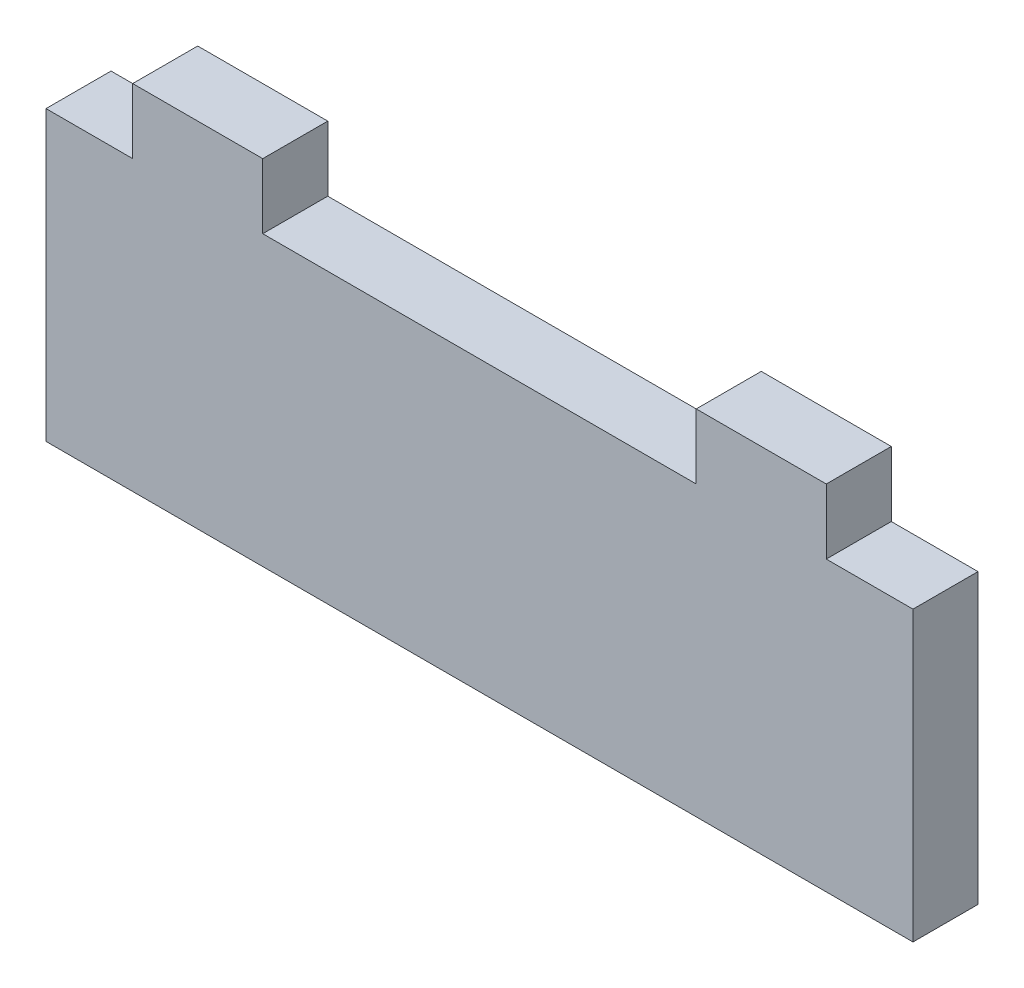
ISO-10303-21;
HEADER;
FILE_DESCRIPTION(('STEP AP214'),'2;1');
FILE_NAME('part.step','',(''),(''),'','','');
FILE_SCHEMA(('AUTOMOTIVE_DESIGN { 1 0 10303 214 1 1 1 1 }'));
ENDSEC;
DATA;
#1=APPLICATION_CONTEXT('core data for automotive mechanical design processes');
#2=APPLICATION_PROTOCOL_DEFINITION('international standard','automotive_design',2000,#1);
#3=PRODUCT_CONTEXT('',#1,'mechanical');
#4=PRODUCT('Part','Part','',(#3));
#5=PRODUCT_RELATED_PRODUCT_CATEGORY('part','',(#4));
#6=PRODUCT_DEFINITION_FORMATION('','',#4);
#7=PRODUCT_DEFINITION_CONTEXT('part definition',#1,'design');
#8=PRODUCT_DEFINITION('design','',#6,#7);
#9=PRODUCT_DEFINITION_SHAPE('','',#8);
#10=(LENGTH_UNIT() NAMED_UNIT(*) SI_UNIT(.MILLI.,.METRE.));
#11=(NAMED_UNIT(*) PLANE_ANGLE_UNIT() SI_UNIT($,.RADIAN.));
#12=(NAMED_UNIT(*) SI_UNIT($,.STERADIAN.) SOLID_ANGLE_UNIT());
#13=UNCERTAINTY_MEASURE_WITH_UNIT(LENGTH_MEASURE(1.E-05),#10,'distance_accuracy_value','');
#14=(GEOMETRIC_REPRESENTATION_CONTEXT(3) GLOBAL_UNCERTAINTY_ASSIGNED_CONTEXT((#13)) GLOBAL_UNIT_ASSIGNED_CONTEXT((#10,
#11,#12)) REPRESENTATION_CONTEXT('',''));
#15=CARTESIAN_POINT('',(0.,0.,0.));
#16=DIRECTION('',(0.,0.,1.));
#17=DIRECTION('',(1.,0.,0.));
#18=AXIS2_PLACEMENT_3D('',#15,#16,#17);
#19=CARTESIAN_POINT('',(-20.,0.,3.));
#20=DIRECTION('',(-1.,0.,0.));
#21=DIRECTION('',(0.,-1.,0.));
#22=AXIS2_PLACEMENT_3D('',#19,#20,#21);
#23=PLANE('',#22);
#24=DIRECTION('',(0.,1.,0.));
#25=VECTOR('',#24,1.);
#26=CARTESIAN_POINT('',(-20.,0.,0.));
#27=LINE('',#26,#25);
#28=CARTESIAN_POINT('',(-20.,-6.65,0.));
#29=VERTEX_POINT('',#28);
#30=CARTESIAN_POINT('',(-20.,6.65,0.));
#31=VERTEX_POINT('',#30);
#32=EDGE_CURVE('E158',#29,#31,#27,.T.);
#33=ORIENTED_EDGE('',*,*,#32,.F.);
#34=DIRECTION('',(0.,0.,-1.));
#35=VECTOR('',#34,1.);
#36=CARTESIAN_POINT('',(-20.,-6.65,3.));
#37=LINE('',#36,#35);
#38=CARTESIAN_POINT('',(-20.,-6.65,3.));
#39=VERTEX_POINT('',#38);
#40=EDGE_CURVE('E11',#39,#29,#37,.T.);
#41=ORIENTED_EDGE('',*,*,#40,.F.);
#42=DIRECTION('',(0.,1.,0.));
#43=VECTOR('',#42,1.);
#44=CARTESIAN_POINT('',(-20.,0.,3.));
#45=LINE('',#44,#43);
#46=CARTESIAN_POINT('',(-20.,6.65,3.));
#47=VERTEX_POINT('',#46);
#48=EDGE_CURVE('E219',#39,#47,#45,.T.);
#49=ORIENTED_EDGE('',*,*,#48,.T.);
#50=DIRECTION('',(0.,0.,-1.));
#51=VECTOR('',#50,1.);
#52=CARTESIAN_POINT('',(-20.,6.65,3.));
#53=LINE('',#52,#51);
#54=EDGE_CURVE('E103',#47,#31,#53,.T.);
#55=ORIENTED_EDGE('',*,*,#54,.T.);
#56=EDGE_LOOP('',(#33,#41,#49,#55));
#57=FACE_BOUND('',#56,.T.);
#58=ADVANCED_FACE('F41',(#57),#23,.T.);
#59=CARTESIAN_POINT('',(0.,-6.65,3.));
#60=DIRECTION('',(0.,-1.,0.));
#61=DIRECTION('',(1.,0.,0.));
#62=AXIS2_PLACEMENT_3D('',#59,#60,#61);
#63=PLANE('',#62);
#64=DIRECTION('',(-1.,0.,0.));
#65=VECTOR('',#64,1.);
#66=CARTESIAN_POINT('',(0.,-6.65,0.));
#67=LINE('',#66,#65);
#68=CARTESIAN_POINT('',(20.,-6.65,0.));
#69=VERTEX_POINT('',#68);
#70=EDGE_CURVE('E161',#69,#29,#67,.T.);
#71=ORIENTED_EDGE('',*,*,#70,.F.);
#72=DIRECTION('',(0.,0.,-1.));
#73=VECTOR('',#72,1.);
#74=CARTESIAN_POINT('',(20.,-6.65,3.));
#75=LINE('',#74,#73);
#76=CARTESIAN_POINT('',(20.,-6.65,3.));
#77=VERTEX_POINT('',#76);
#78=EDGE_CURVE('E49',#77,#69,#75,.T.);
#79=ORIENTED_EDGE('',*,*,#78,.F.);
#80=DIRECTION('',(-1.,0.,0.));
#81=VECTOR('',#80,1.);
#82=CARTESIAN_POINT('',(0.,-6.65,3.));
#83=LINE('',#82,#81);
#84=EDGE_CURVE('E218',#77,#39,#83,.T.);
#85=ORIENTED_EDGE('',*,*,#84,.T.);
#86=ORIENTED_EDGE('',*,*,#40,.T.);
#87=EDGE_LOOP('',(#71,#79,#85,#86));
#88=FACE_BOUND('',#87,.T.);
#89=ADVANCED_FACE('F217',(#88),#63,.T.);
#90=CARTESIAN_POINT('',(20.,0.,3.));
#91=DIRECTION('',(-1.,0.,0.));
#92=DIRECTION('',(0.,-1.,0.));
#93=AXIS2_PLACEMENT_3D('',#90,#91,#92);
#94=PLANE('',#93);
#95=DIRECTION('',(0.,1.,0.));
#96=VECTOR('',#95,1.);
#97=CARTESIAN_POINT('',(20.,0.,0.));
#98=LINE('',#97,#96);
#99=CARTESIAN_POINT('',(20.,6.65,0.));
#100=VERTEX_POINT('',#99);
#101=EDGE_CURVE('E164',#69,#100,#98,.T.);
#102=ORIENTED_EDGE('',*,*,#101,.T.);
#103=DIRECTION('',(0.,0.,-1.));
#104=VECTOR('',#103,1.);
#105=CARTESIAN_POINT('',(20.,6.65,3.));
#106=LINE('',#105,#104);
#107=CARTESIAN_POINT('',(20.,6.65,3.));
#108=VERTEX_POINT('',#107);
#109=EDGE_CURVE('E201',#108,#100,#106,.T.);
#110=ORIENTED_EDGE('',*,*,#109,.F.);
#111=DIRECTION('',(0.,1.,0.));
#112=VECTOR('',#111,1.);
#113=CARTESIAN_POINT('',(20.,0.,3.));
#114=LINE('',#113,#112);
#115=EDGE_CURVE('E208',#77,#108,#114,.T.);
#116=ORIENTED_EDGE('',*,*,#115,.F.);
#117=ORIENTED_EDGE('',*,*,#78,.T.);
#118=EDGE_LOOP('',(#102,#110,#116,#117));
#119=FACE_BOUND('',#118,.T.);
#120=ADVANCED_FACE('F206',(#119),#94,.F.);
#121=CARTESIAN_POINT('',(0.,6.65,3.));
#122=DIRECTION('',(0.,-1.,0.));
#123=DIRECTION('',(1.,0.,0.));
#124=AXIS2_PLACEMENT_3D('',#121,#122,#123);
#125=PLANE('',#124);
#126=DIRECTION('',(-1.,0.,0.));
#127=VECTOR('',#126,1.);
#128=CARTESIAN_POINT('',(0.,6.65,0.));
#129=LINE('',#128,#127);
#130=CARTESIAN_POINT('',(16.,6.65,0.));
#131=VERTEX_POINT('',#130);
#132=EDGE_CURVE('E166',#100,#131,#129,.T.);
#133=ORIENTED_EDGE('',*,*,#132,.T.);
#134=DIRECTION('',(0.,0.,-1.));
#135=VECTOR('',#134,1.);
#136=CARTESIAN_POINT('',(16.,6.65,3.));
#137=LINE('',#136,#135);
#138=CARTESIAN_POINT('',(16.,6.65,3.));
#139=VERTEX_POINT('',#138);
#140=EDGE_CURVE('E198',#139,#131,#137,.T.);
#141=ORIENTED_EDGE('',*,*,#140,.F.);
#142=DIRECTION('',(-1.,0.,0.));
#143=VECTOR('',#142,1.);
#144=CARTESIAN_POINT('',(0.,6.65,3.));
#145=LINE('',#144,#143);
#146=EDGE_CURVE('E224',#108,#139,#145,.T.);
#147=ORIENTED_EDGE('',*,*,#146,.F.);
#148=ORIENTED_EDGE('',*,*,#109,.T.);
#149=EDGE_LOOP('',(#133,#141,#147,#148));
#150=FACE_BOUND('',#149,.T.);
#151=ADVANCED_FACE('F256',(#150),#125,.F.);
#152=CARTESIAN_POINT('',(16.,0.,3.));
#153=DIRECTION('',(-1.,0.,0.));
#154=DIRECTION('',(0.,0.,1.));
#155=AXIS2_PLACEMENT_3D('',#152,#153,#154);
#156=PLANE('',#155);
#157=DIRECTION('',(0.,1.,0.));
#158=VECTOR('',#157,1.);
#159=CARTESIAN_POINT('',(16.,0.,0.));
#160=LINE('',#159,#158);
#161=CARTESIAN_POINT('',(16.,9.65,0.));
#162=VERTEX_POINT('',#161);
#163=EDGE_CURVE('E168',#131,#162,#160,.T.);
#164=ORIENTED_EDGE('',*,*,#163,.T.);
#165=DIRECTION('',(0.,0.,-1.));
#166=VECTOR('',#165,1.);
#167=CARTESIAN_POINT('',(16.,9.65,3.));
#168=LINE('',#167,#166);
#169=CARTESIAN_POINT('',(16.,9.65,3.));
#170=VERTEX_POINT('',#169);
#171=EDGE_CURVE('E195',#170,#162,#168,.T.);
#172=ORIENTED_EDGE('',*,*,#171,.F.);
#173=DIRECTION('',(0.,1.,0.));
#174=VECTOR('',#173,1.);
#175=CARTESIAN_POINT('',(16.,0.,3.));
#176=LINE('',#175,#174);
#177=EDGE_CURVE('E226',#139,#170,#176,.T.);
#178=ORIENTED_EDGE('',*,*,#177,.F.);
#179=ORIENTED_EDGE('',*,*,#140,.T.);
#180=EDGE_LOOP('',(#164,#172,#178,#179));
#181=FACE_BOUND('',#180,.T.);
#182=ADVANCED_FACE('F251',(#181),#156,.F.);
#183=CARTESIAN_POINT('',(0.,9.65,3.));
#184=DIRECTION('',(0.,-1.,0.));
#185=DIRECTION('',(1.,0.,0.));
#186=AXIS2_PLACEMENT_3D('',#183,#184,#185);
#187=PLANE('',#186);
#188=DIRECTION('',(-1.,0.,0.));
#189=VECTOR('',#188,1.);
#190=CARTESIAN_POINT('',(0.,9.65,0.));
#191=LINE('',#190,#189);
#192=CARTESIAN_POINT('',(10.,9.65,0.));
#193=VERTEX_POINT('',#192);
#194=EDGE_CURVE('E170',#162,#193,#191,.T.);
#195=ORIENTED_EDGE('',*,*,#194,.T.);
#196=DIRECTION('',(0.,0.,-1.));
#197=VECTOR('',#196,1.);
#198=CARTESIAN_POINT('',(10.,9.65,3.));
#199=LINE('',#198,#197);
#200=CARTESIAN_POINT('',(10.,9.65,3.));
#201=VERTEX_POINT('',#200);
#202=EDGE_CURVE('E193',#201,#193,#199,.T.);
#203=ORIENTED_EDGE('',*,*,#202,.F.);
#204=DIRECTION('',(-1.,0.,0.));
#205=VECTOR('',#204,1.);
#206=CARTESIAN_POINT('',(0.,9.65,3.));
#207=LINE('',#206,#205);
#208=EDGE_CURVE('E228',#170,#201,#207,.T.);
#209=ORIENTED_EDGE('',*,*,#208,.F.);
#210=ORIENTED_EDGE('',*,*,#171,.T.);
#211=EDGE_LOOP('',(#195,#203,#209,#210));
#212=FACE_BOUND('',#211,.T.);
#213=ADVANCED_FACE('F248',(#212),#187,.F.);
#214=CARTESIAN_POINT('',(10.,0.,3.));
#215=DIRECTION('',(-1.,0.,0.));
#216=DIRECTION('',(0.,0.,1.));
#217=AXIS2_PLACEMENT_3D('',#214,#215,#216);
#218=PLANE('',#217);
#219=DIRECTION('',(0.,1.,0.));
#220=VECTOR('',#219,1.);
#221=CARTESIAN_POINT('',(10.,0.,0.));
#222=LINE('',#221,#220);
#223=CARTESIAN_POINT('',(10.,6.65,0.));
#224=VERTEX_POINT('',#223);
#225=EDGE_CURVE('E173',#224,#193,#222,.T.);
#226=ORIENTED_EDGE('',*,*,#225,.F.);
#227=DIRECTION('',(0.,0.,-1.));
#228=VECTOR('',#227,1.);
#229=CARTESIAN_POINT('',(10.,6.65,3.));
#230=LINE('',#229,#228);
#231=CARTESIAN_POINT('',(10.,6.65,3.));
#232=VERTEX_POINT('',#231);
#233=EDGE_CURVE('E191',#232,#224,#230,.T.);
#234=ORIENTED_EDGE('',*,*,#233,.F.);
#235=DIRECTION('',(0.,1.,0.));
#236=VECTOR('',#235,1.);
#237=CARTESIAN_POINT('',(10.,0.,3.));
#238=LINE('',#237,#236);
#239=EDGE_CURVE('E230',#232,#201,#238,.T.);
#240=ORIENTED_EDGE('',*,*,#239,.T.);
#241=ORIENTED_EDGE('',*,*,#202,.T.);
#242=EDGE_LOOP('',(#226,#234,#240,#241));
#243=FACE_BOUND('',#242,.T.);
#244=ADVANCED_FACE('F244',(#243),#218,.T.);
#245=CARTESIAN_POINT('',(0.,6.65,3.));
#246=DIRECTION('',(0.,-1.,0.));
#247=DIRECTION('',(1.,0.,0.));
#248=AXIS2_PLACEMENT_3D('',#245,#246,#247);
#249=PLANE('',#248);
#250=DIRECTION('',(-1.,0.,0.));
#251=VECTOR('',#250,1.);
#252=CARTESIAN_POINT('',(0.,6.65,0.));
#253=LINE('',#252,#251);
#254=CARTESIAN_POINT('',(-10.,6.65,0.));
#255=VERTEX_POINT('',#254);
#256=EDGE_CURVE('E176',#224,#255,#253,.T.);
#257=ORIENTED_EDGE('',*,*,#256,.T.);
#258=DIRECTION('',(0.,0.,-1.));
#259=VECTOR('',#258,1.);
#260=CARTESIAN_POINT('',(-10.,6.65,3.));
#261=LINE('',#260,#259);
#262=CARTESIAN_POINT('',(-10.,6.65,3.));
#263=VERTEX_POINT('',#262);
#264=EDGE_CURVE('E188',#263,#255,#261,.T.);
#265=ORIENTED_EDGE('',*,*,#264,.F.);
#266=DIRECTION('',(-1.,0.,0.));
#267=VECTOR('',#266,1.);
#268=CARTESIAN_POINT('',(0.,6.65,3.));
#269=LINE('',#268,#267);
#270=EDGE_CURVE('E155',#232,#263,#269,.T.);
#271=ORIENTED_EDGE('',*,*,#270,.F.);
#272=ORIENTED_EDGE('',*,*,#233,.T.);
#273=EDGE_LOOP('',(#257,#265,#271,#272));
#274=FACE_BOUND('',#273,.T.);
#275=ADVANCED_FACE('F236',(#274),#249,.F.);
#276=CARTESIAN_POINT('',(-10.,0.,3.));
#277=DIRECTION('',(-1.,0.,0.));
#278=DIRECTION('',(0.,0.,1.));
#279=AXIS2_PLACEMENT_3D('',#276,#277,#278);
#280=PLANE('',#279);
#281=DIRECTION('',(0.,1.,0.));
#282=VECTOR('',#281,1.);
#283=CARTESIAN_POINT('',(-10.,0.,0.));
#284=LINE('',#283,#282);
#285=CARTESIAN_POINT('',(-10.,9.65,0.));
#286=VERTEX_POINT('',#285);
#287=EDGE_CURVE('E178',#255,#286,#284,.T.);
#288=ORIENTED_EDGE('',*,*,#287,.T.);
#289=DIRECTION('',(0.,0.,-1.));
#290=VECTOR('',#289,1.);
#291=CARTESIAN_POINT('',(-10.,9.65,3.));
#292=LINE('',#291,#290);
#293=CARTESIAN_POINT('',(-10.,9.65,3.));
#294=VERTEX_POINT('',#293);
#295=EDGE_CURVE('E144',#294,#286,#292,.T.);
#296=ORIENTED_EDGE('',*,*,#295,.F.);
#297=DIRECTION('',(0.,1.,0.));
#298=VECTOR('',#297,1.);
#299=CARTESIAN_POINT('',(-10.,0.,3.));
#300=LINE('',#299,#298);
#301=EDGE_CURVE('E149',#263,#294,#300,.T.);
#302=ORIENTED_EDGE('',*,*,#301,.F.);
#303=ORIENTED_EDGE('',*,*,#264,.T.);
#304=EDGE_LOOP('',(#288,#296,#302,#303));
#305=FACE_BOUND('',#304,.T.);
#306=ADVANCED_FACE('F240',(#305),#280,.F.);
#307=CARTESIAN_POINT('',(0.,9.65,3.));
#308=DIRECTION('',(0.,1.,0.));
#309=DIRECTION('',(0.,0.,1.));
#310=AXIS2_PLACEMENT_3D('',#307,#308,#309);
#311=PLANE('',#310);
#312=DIRECTION('',(1.,0.,0.));
#313=VECTOR('',#312,1.);
#314=CARTESIAN_POINT('',(0.,9.65,0.));
#315=LINE('',#314,#313);
#316=CARTESIAN_POINT('',(-16.,9.65,0.));
#317=VERTEX_POINT('',#316);
#318=EDGE_CURVE('E139',#317,#286,#315,.T.);
#319=ORIENTED_EDGE('',*,*,#318,.F.);
#320=DIRECTION('',(0.,0.,-1.));
#321=VECTOR('',#320,1.);
#322=CARTESIAN_POINT('',(-16.,9.65,3.));
#323=LINE('',#322,#321);
#324=CARTESIAN_POINT('',(-16.,9.65,3.));
#325=VERTEX_POINT('',#324);
#326=EDGE_CURVE('E134',#325,#317,#323,.T.);
#327=ORIENTED_EDGE('',*,*,#326,.F.);
#328=DIRECTION('',(1.,0.,0.));
#329=VECTOR('',#328,1.);
#330=CARTESIAN_POINT('',(0.,9.65,3.));
#331=LINE('',#330,#329);
#332=EDGE_CURVE('E137',#325,#294,#331,.T.);
#333=ORIENTED_EDGE('',*,*,#332,.T.);
#334=ORIENTED_EDGE('',*,*,#295,.T.);
#335=EDGE_LOOP('',(#319,#327,#333,#334));
#336=FACE_BOUND('',#335,.T.);
#337=ADVANCED_FACE('F136',(#336),#311,.T.);
#338=CARTESIAN_POINT('',(-16.,0.,3.));
#339=DIRECTION('',(-1.,0.,0.));
#340=DIRECTION('',(0.,0.,1.));
#341=AXIS2_PLACEMENT_3D('',#338,#339,#340);
#342=PLANE('',#341);
#343=DIRECTION('',(0.,1.,0.));
#344=VECTOR('',#343,1.);
#345=CARTESIAN_POINT('',(-16.,0.,0.));
#346=LINE('',#345,#344);
#347=CARTESIAN_POINT('',(-16.,6.65,0.));
#348=VERTEX_POINT('',#347);
#349=EDGE_CURVE('E183',#348,#317,#346,.T.);
#350=ORIENTED_EDGE('',*,*,#349,.F.);
#351=DIRECTION('',(0.,0.,-1.));
#352=VECTOR('',#351,1.);
#353=CARTESIAN_POINT('',(-16.,6.65,3.));
#354=LINE('',#353,#352);
#355=CARTESIAN_POINT('',(-16.,6.65,3.));
#356=VERTEX_POINT('',#355);
#357=EDGE_CURVE('E96',#356,#348,#354,.T.);
#358=ORIENTED_EDGE('',*,*,#357,.F.);
#359=DIRECTION('',(0.,1.,0.));
#360=VECTOR('',#359,1.);
#361=CARTESIAN_POINT('',(-16.,0.,3.));
#362=LINE('',#361,#360);
#363=EDGE_CURVE('E147',#356,#325,#362,.T.);
#364=ORIENTED_EDGE('',*,*,#363,.T.);
#365=ORIENTED_EDGE('',*,*,#326,.T.);
#366=EDGE_LOOP('',(#350,#358,#364,#365));
#367=FACE_BOUND('',#366,.T.);
#368=ADVANCED_FACE('F152',(#367),#342,.T.);
#369=EDGE_CURVE('E179',#348,#31,#253,.T.);
#370=ORIENTED_EDGE('',*,*,#369,.T.);
#371=ORIENTED_EDGE('',*,*,#54,.F.);
#372=EDGE_CURVE('E57',#356,#47,#269,.T.);
#373=ORIENTED_EDGE('',*,*,#372,.F.);
#374=ORIENTED_EDGE('',*,*,#357,.T.);
#375=EDGE_LOOP('',(#370,#371,#373,#374));
#376=FACE_BOUND('',#375,.T.);
#377=ADVANCED_FACE('F316',(#376),#249,.F.);
#378=CARTESIAN_POINT('',(0.,0.,3.));
#379=DIRECTION('',(0.,0.,1.));
#380=DIRECTION('',(1.,0.,0.));
#381=AXIS2_PLACEMENT_3D('',#378,#379,#380);
#382=PLANE('',#381);
#383=ORIENTED_EDGE('',*,*,#48,.F.);
#384=ORIENTED_EDGE('',*,*,#84,.F.);
#385=ORIENTED_EDGE('',*,*,#115,.T.);
#386=ORIENTED_EDGE('',*,*,#146,.T.);
#387=ORIENTED_EDGE('',*,*,#177,.T.);
#388=ORIENTED_EDGE('',*,*,#208,.T.);
#389=ORIENTED_EDGE('',*,*,#239,.F.);
#390=ORIENTED_EDGE('',*,*,#270,.T.);
#391=ORIENTED_EDGE('',*,*,#301,.T.);
#392=ORIENTED_EDGE('',*,*,#332,.F.);
#393=ORIENTED_EDGE('',*,*,#363,.F.);
#394=ORIENTED_EDGE('',*,*,#372,.T.);
#395=EDGE_LOOP('',(#383,#384,#385,#386,#387,#388,#389,#390,#391,#392,#393,#394));
#396=FACE_BOUND('',#395,.T.);
#397=ADVANCED_FACE('F146',(#396),#382,.T.);
#398=CARTESIAN_POINT('',(0.,0.,0.));
#399=DIRECTION('',(0.,0.,1.));
#400=DIRECTION('',(1.,0.,0.));
#401=AXIS2_PLACEMENT_3D('',#398,#399,#400);
#402=PLANE('',#401);
#403=ORIENTED_EDGE('',*,*,#32,.T.);
#404=ORIENTED_EDGE('',*,*,#369,.F.);
#405=ORIENTED_EDGE('',*,*,#349,.T.);
#406=ORIENTED_EDGE('',*,*,#318,.T.);
#407=ORIENTED_EDGE('',*,*,#287,.F.);
#408=ORIENTED_EDGE('',*,*,#256,.F.);
#409=ORIENTED_EDGE('',*,*,#225,.T.);
#410=ORIENTED_EDGE('',*,*,#194,.F.);
#411=ORIENTED_EDGE('',*,*,#163,.F.);
#412=ORIENTED_EDGE('',*,*,#132,.F.);
#413=ORIENTED_EDGE('',*,*,#101,.F.);
#414=ORIENTED_EDGE('',*,*,#70,.T.);
#415=EDGE_LOOP('',(#403,#404,#405,#406,#407,#408,#409,#410,#411,#412,#413,#414));
#416=FACE_BOUND('',#415,.T.);
#417=ADVANCED_FACE('F215',(#416),#402,.F.);
#418=CLOSED_SHELL('',(#58,#89,#120,#151,#182,#213,#244,#275,#306,#337,#368,#377,#397,#417));
#419=MANIFOLD_SOLID_BREP('B2',#418);
#420=ADVANCED_BREP_SHAPE_REPRESENTATION('',(#18,#419),#14);
#421=SHAPE_DEFINITION_REPRESENTATION(#9,#420);
ENDSEC;
END-ISO-10303-21;
